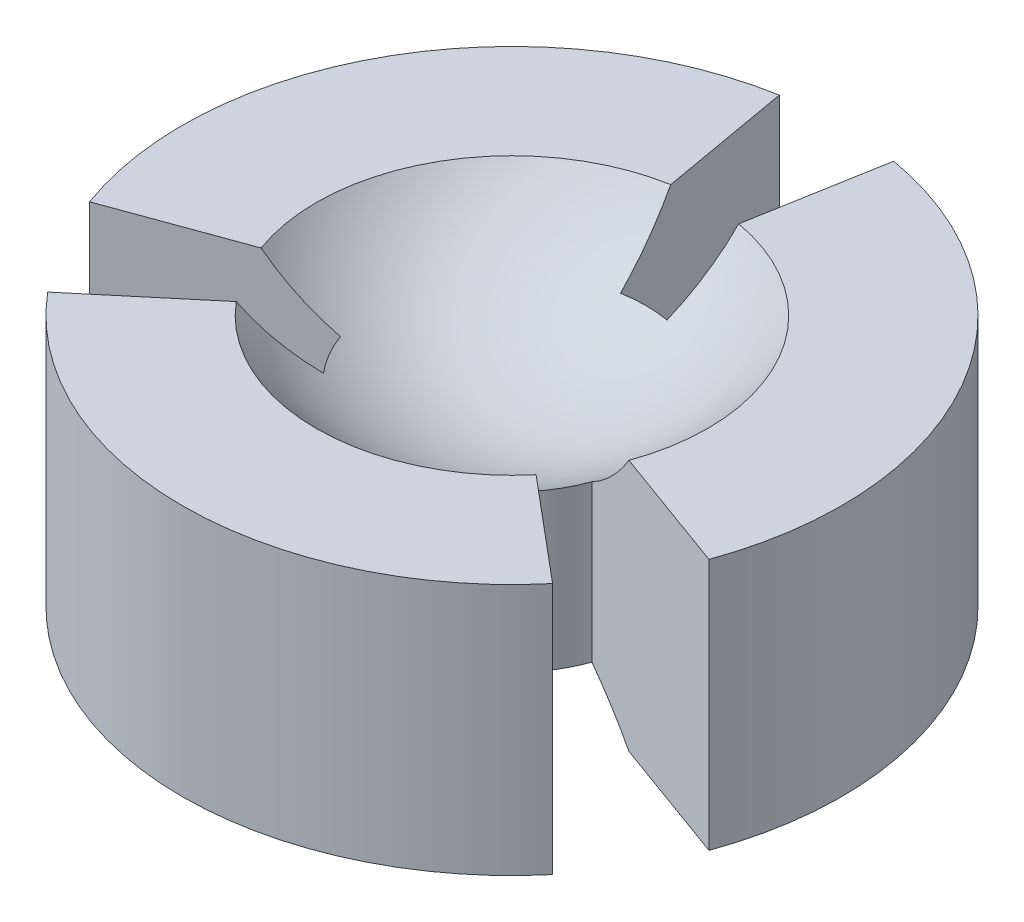
ISO-10303-21;
HEADER;
FILE_DESCRIPTION(('STEP AP214'),'2;1');
FILE_NAME('part.step','',(''),(''),'','','');
FILE_SCHEMA(('AUTOMOTIVE_DESIGN { 1 0 10303 214 1 1 1 1 }'));
ENDSEC;
DATA;
#1=APPLICATION_CONTEXT('core data for automotive mechanical design processes');
#2=APPLICATION_PROTOCOL_DEFINITION('international standard','automotive_design',2000,#1);
#3=PRODUCT_CONTEXT('',#1,'mechanical');
#4=PRODUCT('Part','Part','',(#3));
#5=PRODUCT_RELATED_PRODUCT_CATEGORY('part','',(#4));
#6=PRODUCT_DEFINITION_FORMATION('','',#4);
#7=PRODUCT_DEFINITION_CONTEXT('part definition',#1,'design');
#8=PRODUCT_DEFINITION('design','',#6,#7);
#9=PRODUCT_DEFINITION_SHAPE('','',#8);
#10=(LENGTH_UNIT() NAMED_UNIT(*) SI_UNIT(.MILLI.,.METRE.));
#11=(NAMED_UNIT(*) PLANE_ANGLE_UNIT() SI_UNIT($,.RADIAN.));
#12=(NAMED_UNIT(*) SI_UNIT($,.STERADIAN.) SOLID_ANGLE_UNIT());
#13=UNCERTAINTY_MEASURE_WITH_UNIT(LENGTH_MEASURE(1.E-05),#10,'distance_accuracy_value','');
#14=(GEOMETRIC_REPRESENTATION_CONTEXT(3) GLOBAL_UNCERTAINTY_ASSIGNED_CONTEXT((#13)) GLOBAL_UNIT_ASSIGNED_CONTEXT((#10,
#11,#12)) REPRESENTATION_CONTEXT('',''));
#15=CARTESIAN_POINT('',(0.,0.,0.));
#16=DIRECTION('',(0.,0.,1.));
#17=DIRECTION('',(1.,0.,0.));
#18=AXIS2_PLACEMENT_3D('',#15,#16,#17);
#19=CARTESIAN_POINT('',(0.,5.6,0.));
#20=DIRECTION('',(0.,1.,0.));
#21=DIRECTION('',(-1.,0.,0.));
#22=AXIS2_PLACEMENT_3D('',#19,#20,#21);
#23=PLANE('',#22);
#24=CARTESIAN_POINT('',(0.,5.6,0.));
#25=DIRECTION('',(0.,1.,0.));
#26=DIRECTION('',(-1.,0.,0.));
#27=AXIS2_PLACEMENT_3D('',#24,#25,#26);
#28=CIRCLE('',#27,4.92502957221124);
#29=CARTESIAN_POINT('',(-0.855222410170228,5.6,-4.85020730652802));
#30=VERTEX_POINT('',#29);
#31=CARTESIAN_POINT('',(-4.62801394615928,5.6,1.68445932017083));
#32=VERTEX_POINT('',#31);
#33=EDGE_CURVE('E351',#30,#32,#28,.T.);
#34=ORIENTED_EDGE('',*,*,#33,.F.);
#35=DIRECTION('',(0.173648177666931,0.,0.984807753012208));
#36=VECTOR('',#35,1.);
#37=CARTESIAN_POINT('',(-0.347296355333863,5.6,-1.96961550602442));
#38=LINE('',#37,#36);
#39=CARTESIAN_POINT('',(-0.507926054836366,5.6,-2.88059180050361));
#40=VERTEX_POINT('',#39);
#41=EDGE_CURVE('E375',#30,#40,#38,.T.);
#42=ORIENTED_EDGE('',*,*,#41,.T.);
#43=CARTESIAN_POINT('',(0.,5.6,0.));
#44=DIRECTION('',(0.,1.,0.));
#45=DIRECTION('',(-1.,0.,0.));
#46=AXIS2_PLACEMENT_3D('',#43,#44,#45);
#47=CIRCLE('',#46,2.92502957221124);
#48=CARTESIAN_POINT('',(-2.74862870458747,5.6,1.00041903351949));
#49=VERTEX_POINT('',#48);
#50=EDGE_CURVE('E216',#40,#49,#47,.T.);
#51=ORIENTED_EDGE('',*,*,#50,.T.);
#52=DIRECTION('',(-0.939692620785908,0.,0.342020143325671));
#53=VECTOR('',#52,1.);
#54=CARTESIAN_POINT('',(-1.87938524157182,5.6,0.68404028665132));
#55=LINE('',#54,#53);
#56=EDGE_CURVE('E307',#49,#32,#55,.T.);
#57=ORIENTED_EDGE('',*,*,#56,.T.);
#58=EDGE_LOOP('',(#34,#42,#51,#57));
#59=FACE_BOUND('',#58,.T.);
#60=ADVANCED_FACE('F47',(#59),#23,.F.);
#61=CARTESIAN_POINT('',(2.74862870458746,5.6,1.00041903351951));
#62=VERTEX_POINT('',#61);
#63=CARTESIAN_POINT('',(0.507926054836363,5.6,-2.88059180050361));
#64=VERTEX_POINT('',#63);
#65=EDGE_CURVE('E222',#62,#64,#47,.T.);
#66=ORIENTED_EDGE('',*,*,#65,.T.);
#67=DIRECTION('',(0.173648177666931,0.,-0.984807753012208));
#68=VECTOR('',#67,1.);
#69=CARTESIAN_POINT('',(0.34729635533386,5.6,-1.96961550602442));
#70=LINE('',#69,#68);
#71=CARTESIAN_POINT('',(0.855222410170223,5.6,-4.85020730652802));
#72=VERTEX_POINT('',#71);
#73=EDGE_CURVE('E372',#64,#72,#70,.T.);
#74=ORIENTED_EDGE('',*,*,#73,.T.);
#75=CARTESIAN_POINT('',(4.62801394615928,5.6,1.68445932017084));
#76=VERTEX_POINT('',#75);
#77=EDGE_CURVE('E353',#76,#72,#28,.T.);
#78=ORIENTED_EDGE('',*,*,#77,.F.);
#79=DIRECTION('',(-0.939692620785909,0.,-0.342020143325666));
#80=VECTOR('',#79,1.);
#81=CARTESIAN_POINT('',(1.87938524157181,5.6,0.684040286651345));
#82=LINE('',#81,#80);
#83=EDGE_CURVE('E280',#76,#62,#82,.T.);
#84=ORIENTED_EDGE('',*,*,#83,.T.);
#85=EDGE_LOOP('',(#66,#74,#78,#84));
#86=FACE_BOUND('',#85,.T.);
#87=ADVANCED_FACE('F370',(#86),#23,.F.);
#88=CARTESIAN_POINT('',(0.,9.36672218861416,0.));
#89=DIRECTION('',(0.,1.,0.));
#90=DIRECTION('',(-1.,0.,0.));
#91=AXIS2_PLACEMENT_3D('',#88,#89,#90);
#92=PLANE('',#91);
#93=DIRECTION('',(0.173648177666931,0.,0.984807753012208));
#94=VECTOR('',#93,1.);
#95=CARTESIAN_POINT('',(-0.347296355333863,9.36672218861416,-1.96961550602442));
#96=LINE('',#95,#94);
#97=CARTESIAN_POINT('',(-0.855222410170228,9.36672218861416,-4.85020730652802));
#98=VERTEX_POINT('',#97);
#99=CARTESIAN_POINT('',(-0.507926054836365,9.36672218861416,-2.8805918005036));
#100=VERTEX_POINT('',#99);
#101=EDGE_CURVE('E376',#98,#100,#96,.T.);
#102=ORIENTED_EDGE('',*,*,#101,.F.);
#103=CARTESIAN_POINT('',(0.,9.36672218861416,0.));
#104=DIRECTION('',(0.,1.,0.));
#105=DIRECTION('',(-1.,0.,0.));
#106=AXIS2_PLACEMENT_3D('',#103,#104,#105);
#107=CIRCLE('',#106,4.92502957221123);
#108=CARTESIAN_POINT('',(-4.62801394615928,9.36672218861416,1.68445932017083));
#109=VERTEX_POINT('',#108);
#110=EDGE_CURVE('E194',#98,#109,#107,.T.);
#111=ORIENTED_EDGE('',*,*,#110,.T.);
#112=DIRECTION('',(-0.939692620785908,0.,0.342020143325671));
#113=VECTOR('',#112,1.);
#114=CARTESIAN_POINT('',(-1.87938524157182,9.36672218861416,0.68404028665132));
#115=LINE('',#114,#113);
#116=CARTESIAN_POINT('',(-2.74862870458746,9.36672218861416,1.00041903351949));
#117=VERTEX_POINT('',#116);
#118=EDGE_CURVE('E176',#117,#109,#115,.T.);
#119=ORIENTED_EDGE('',*,*,#118,.F.);
#120=CARTESIAN_POINT('',(0.,9.36672218861415,0.));
#121=DIRECTION('',(0.,1.,0.));
#122=DIRECTION('',(-1.,0.,0.));
#123=AXIS2_PLACEMENT_3D('',#120,#121,#122);
#124=CIRCLE('',#123,2.92502957221123);
#125=EDGE_CURVE('E192',#100,#117,#124,.T.);
#126=ORIENTED_EDGE('',*,*,#125,.F.);
#127=EDGE_LOOP('',(#102,#111,#119,#126));
#128=FACE_BOUND('',#127,.T.);
#129=ADVANCED_FACE('F191',(#128),#92,.T.);
#130=DIRECTION('',(0.173648177666931,0.,-0.984807753012208));
#131=VECTOR('',#130,1.);
#132=CARTESIAN_POINT('',(0.34729635533386,9.36672218861416,-1.96961550602442));
#133=LINE('',#132,#131);
#134=CARTESIAN_POINT('',(0.507926054836362,9.36672218861416,-2.88059180050361));
#135=VERTEX_POINT('',#134);
#136=CARTESIAN_POINT('',(0.855222410170223,9.36672218861416,-4.85020730652802));
#137=VERTEX_POINT('',#136);
#138=EDGE_CURVE('E63',#135,#137,#133,.T.);
#139=ORIENTED_EDGE('',*,*,#138,.F.);
#140=CARTESIAN_POINT('',(2.74862870458746,9.36672218861416,1.00041903351951));
#141=VERTEX_POINT('',#140);
#142=EDGE_CURVE('E203',#141,#135,#124,.T.);
#143=ORIENTED_EDGE('',*,*,#142,.F.);
#144=DIRECTION('',(-0.939692620785909,0.,-0.342020143325666));
#145=VECTOR('',#144,1.);
#146=CARTESIAN_POINT('',(1.87938524157181,9.36672218861416,0.684040286651345));
#147=LINE('',#146,#145);
#148=CARTESIAN_POINT('',(4.62801394615928,9.36672218861416,1.68445932017084));
#149=VERTEX_POINT('',#148);
#150=EDGE_CURVE('E292',#149,#141,#147,.T.);
#151=ORIENTED_EDGE('',*,*,#150,.F.);
#152=EDGE_CURVE('E211',#149,#137,#107,.T.);
#153=ORIENTED_EDGE('',*,*,#152,.T.);
#154=EDGE_LOOP('',(#139,#143,#151,#153));
#155=FACE_BOUND('',#154,.T.);
#156=ADVANCED_FACE('F395',(#155),#92,.T.);
#157=CARTESIAN_POINT('',(0.,7.9,0.));
#158=DIRECTION('',(0.,1.,0.));
#159=DIRECTION('',(-1.,0.,0.));
#160=AXIS2_PLACEMENT_3D('',#157,#158,#159);
#161=CYLINDRICAL_SURFACE('',#160,4.92502957221124);
#162=ORIENTED_EDGE('',*,*,#110,.F.);
#163=DIRECTION('',(0.,1.,0.));
#164=VECTOR('',#163,1.);
#165=CARTESIAN_POINT('',(-0.855222410170228,7.9,-4.85020730652802));
#166=LINE('',#165,#164);
#167=EDGE_CURVE('E256',#98,#30,#166,.F.);
#168=ORIENTED_EDGE('',*,*,#167,.T.);
#169=ORIENTED_EDGE('',*,*,#33,.T.);
#170=DIRECTION('',(0.,1.,0.));
#171=VECTOR('',#170,1.);
#172=CARTESIAN_POINT('',(-4.62801394615928,7.9,1.68445932017083));
#173=LINE('',#172,#171);
#174=EDGE_CURVE('E233',#32,#109,#173,.T.);
#175=ORIENTED_EDGE('',*,*,#174,.T.);
#176=EDGE_LOOP('',(#162,#168,#169,#175));
#177=FACE_BOUND('',#176,.T.);
#178=ADVANCED_FACE('F405',(#177),#161,.T.);
#179=ORIENTED_EDGE('',*,*,#77,.T.);
#180=DIRECTION('',(0.,1.,0.));
#181=VECTOR('',#180,1.);
#182=CARTESIAN_POINT('',(0.855222410170223,7.9,-4.85020730652802));
#183=LINE('',#182,#181);
#184=EDGE_CURVE('E253',#72,#137,#183,.T.);
#185=ORIENTED_EDGE('',*,*,#184,.T.);
#186=ORIENTED_EDGE('',*,*,#152,.F.);
#187=DIRECTION('',(0.,1.,0.));
#188=VECTOR('',#187,1.);
#189=CARTESIAN_POINT('',(4.62801394615928,7.9,1.68445932017084));
#190=LINE('',#189,#188);
#191=EDGE_CURVE('E249',#149,#76,#190,.F.);
#192=ORIENTED_EDGE('',*,*,#191,.T.);
#193=EDGE_LOOP('',(#179,#185,#186,#192));
#194=FACE_BOUND('',#193,.T.);
#195=ADVANCED_FACE('F366',(#194),#161,.T.);
#196=CARTESIAN_POINT('',(-2.24070264975111,5.6,1.88017276698409));
#197=VERTEX_POINT('',#196);
#198=CARTESIAN_POINT('',(2.2407026497511,5.6,1.88017276698411));
#199=VERTEX_POINT('',#198);
#200=EDGE_CURVE('E223',#197,#199,#47,.T.);
#201=ORIENTED_EDGE('',*,*,#200,.T.);
#202=DIRECTION('',(0.766044443118979,0.,0.642787609686538));
#203=VECTOR('',#202,1.);
#204=CARTESIAN_POINT('',(1.53208888623795,5.6,1.28557521937309));
#205=LINE('',#204,#203);
#206=CARTESIAN_POINT('',(3.77279153598905,5.6,3.16574798635718));
#207=VERTEX_POINT('',#206);
#208=EDGE_CURVE('E285',#199,#207,#205,.T.);
#209=ORIENTED_EDGE('',*,*,#208,.T.);
#210=CARTESIAN_POINT('',(-3.77279153598906,5.6,3.16574798635718));
#211=VERTEX_POINT('',#210);
#212=EDGE_CURVE('E354',#211,#207,#28,.T.);
#213=ORIENTED_EDGE('',*,*,#212,.F.);
#214=DIRECTION('',(0.766044443118975,0.,-0.642787609686543));
#215=VECTOR('',#214,1.);
#216=CARTESIAN_POINT('',(-1.53208888623797,5.6,1.28557521937307));
#217=LINE('',#216,#215);
#218=EDGE_CURVE('E301',#211,#197,#217,.T.);
#219=ORIENTED_EDGE('',*,*,#218,.T.);
#220=EDGE_LOOP('',(#201,#209,#213,#219));
#221=FACE_BOUND('',#220,.T.);
#222=ADVANCED_FACE('F49',(#221),#23,.F.);
#223=CARTESIAN_POINT('',(0.,1.82210100084488,0.));
#224=DIRECTION('',(0.,1.,0.));
#225=DIRECTION('',(-1.,0.,0.));
#226=AXIS2_PLACEMENT_3D('',#223,#224,#225);
#227=SPHERICAL_SURFACE('',#226,4.77789899915513);
#228=CARTESIAN_POINT('',(0.,1.82210100084488,0.));
#229=DIRECTION('',(-0.984807753012208,0.,0.173648177666931));
#230=DIRECTION('',(0.173648177666931,0.,0.984807753012208));
#231=AXIS2_PLACEMENT_3D('',#228,#229,#230);
#232=CIRCLE('',#231,4.77789899915513);
#233=CARTESIAN_POINT('',(-0.347296355333864,6.16126207715071,-1.96961550602442));
#234=VERTEX_POINT('',#233);
#235=EDGE_CURVE('E339',#234,#40,#232,.T.);
#236=ORIENTED_EDGE('',*,*,#235,.F.);
#237=CARTESIAN_POINT('',(0.,6.16126207715071,0.));
#238=DIRECTION('',(0.,-1.,0.));
#239=DIRECTION('',(0.,0.,-1.));
#240=AXIS2_PLACEMENT_3D('',#237,#238,#239);
#241=CIRCLE('',#240,2.);
#242=CARTESIAN_POINT('',(0.34729635533386,6.16126207715071,-1.96961550602442));
#243=VERTEX_POINT('',#242);
#244=EDGE_CURVE('E348',#243,#234,#241,.F.);
#245=ORIENTED_EDGE('',*,*,#244,.F.);
#246=CARTESIAN_POINT('',(0.,1.82210100084488,0.));
#247=DIRECTION('',(0.984807753012208,0.,0.173648177666931));
#248=DIRECTION('',(0.173648177666931,0.,-0.984807753012208));
#249=AXIS2_PLACEMENT_3D('',#246,#247,#248);
#250=CIRCLE('',#249,4.77789899915513);
#251=EDGE_CURVE('E334',#64,#243,#250,.T.);
#252=ORIENTED_EDGE('',*,*,#251,.F.);
#253=ORIENTED_EDGE('',*,*,#65,.F.);
#254=CARTESIAN_POINT('',(0.,1.82210100084488,0.));
#255=DIRECTION('',(0.342020143325666,0.,-0.939692620785909));
#256=DIRECTION('',(-0.939692620785909,0.,-0.342020143325666));
#257=AXIS2_PLACEMENT_3D('',#254,#255,#256);
#258=CIRCLE('',#257,4.77789899915513);
#259=CARTESIAN_POINT('',(1.87938524157181,6.16126207715071,0.684040286651345));
#260=VERTEX_POINT('',#259);
#261=EDGE_CURVE('E327',#260,#62,#258,.T.);
#262=ORIENTED_EDGE('',*,*,#261,.F.);
#263=CARTESIAN_POINT('',(0.,6.16126207715071,0.));
#264=DIRECTION('',(0.,-1.,0.));
#265=DIRECTION('',(0.,0.,-1.));
#266=AXIS2_PLACEMENT_3D('',#263,#264,#265);
#267=CIRCLE('',#266,2.);
#268=CARTESIAN_POINT('',(1.53208888623795,6.16126207715071,1.28557521937309));
#269=VERTEX_POINT('',#268);
#270=EDGE_CURVE('E345',#269,#260,#267,.F.);
#271=ORIENTED_EDGE('',*,*,#270,.F.);
#272=CARTESIAN_POINT('',(0.,1.82210100084488,0.));
#273=DIRECTION('',(-0.642787609686538,0.,0.766044443118979));
#274=DIRECTION('',(0.766044443118979,0.,0.642787609686538));
#275=AXIS2_PLACEMENT_3D('',#272,#273,#274);
#276=CIRCLE('',#275,4.77789899915513);
#277=EDGE_CURVE('E278',#199,#269,#276,.T.);
#278=ORIENTED_EDGE('',*,*,#277,.F.);
#279=ORIENTED_EDGE('',*,*,#200,.F.);
#280=CARTESIAN_POINT('',(0.,1.82210100084488,0.));
#281=DIRECTION('',(0.642787609686542,0.,0.766044443118975));
#282=DIRECTION('',(0.766044443118976,0.,-0.642787609686543));
#283=AXIS2_PLACEMENT_3D('',#280,#281,#282);
#284=CIRCLE('',#283,4.77789899915513);
#285=CARTESIAN_POINT('',(-1.53208888623797,6.16126207715071,1.28557521937307));
#286=VERTEX_POINT('',#285);
#287=EDGE_CURVE('E318',#286,#197,#284,.T.);
#288=ORIENTED_EDGE('',*,*,#287,.F.);
#289=CARTESIAN_POINT('',(0.,6.16126207715071,0.));
#290=DIRECTION('',(0.,-1.,0.));
#291=DIRECTION('',(0.,0.,-1.));
#292=AXIS2_PLACEMENT_3D('',#289,#290,#291);
#293=CIRCLE('',#292,2.);
#294=CARTESIAN_POINT('',(-1.87938524157182,6.16126207715071,0.68404028665132));
#295=VERTEX_POINT('',#294);
#296=EDGE_CURVE('E342',#295,#286,#293,.F.);
#297=ORIENTED_EDGE('',*,*,#296,.F.);
#298=CARTESIAN_POINT('',(0.,1.82210100084488,0.));
#299=DIRECTION('',(-0.342020143325671,0.,-0.939692620785908));
#300=DIRECTION('',(-0.939692620785908,0.,0.342020143325671));
#301=AXIS2_PLACEMENT_3D('',#298,#299,#300);
#302=CIRCLE('',#301,4.77789899915513);
#303=EDGE_CURVE('E184',#49,#295,#302,.T.);
#304=ORIENTED_EDGE('',*,*,#303,.F.);
#305=ORIENTED_EDGE('',*,*,#50,.F.);
#306=EDGE_LOOP('',(#236,#245,#252,#253,#262,#271,#278,#279,#288,#297,#304,#305));
#307=FACE_BOUND('',#306,.T.);
#308=ADVANCED_FACE('F401',(#307),#227,.F.);
#309=CARTESIAN_POINT('',(0.,11.55,0.));
#310=DIRECTION('',(0.,1.,0.));
#311=DIRECTION('',(-1.,0.,0.));
#312=AXIS2_PLACEMENT_3D('',#309,#310,#311);
#313=SPHERICAL_SURFACE('',#312,3.65);
#314=CARTESIAN_POINT('',(0.,8.49672307184559,0.));
#315=DIRECTION('',(0.,1.,0.));
#316=DIRECTION('',(0.,0.,1.));
#317=AXIS2_PLACEMENT_3D('',#314,#315,#316);
#318=CIRCLE('',#317,2.);
#319=CARTESIAN_POINT('',(0.34729635533386,8.49672307184559,-1.96961550602442));
#320=VERTEX_POINT('',#319);
#321=CARTESIAN_POINT('',(-0.347296355333864,8.49672307184559,-1.96961550602442));
#322=VERTEX_POINT('',#321);
#323=EDGE_CURVE('E11',#320,#322,#318,.T.);
#324=ORIENTED_EDGE('',*,*,#323,.T.);
#325=CARTESIAN_POINT('',(0.,11.55,0.));
#326=DIRECTION('',(-0.984807753012208,0.,0.173648177666931));
#327=DIRECTION('',(0.173648177666931,0.,0.984807753012208));
#328=AXIS2_PLACEMENT_3D('',#325,#326,#327);
#329=CIRCLE('',#328,3.65);
#330=EDGE_CURVE('E201',#322,#100,#329,.F.);
#331=ORIENTED_EDGE('',*,*,#330,.T.);
#332=ORIENTED_EDGE('',*,*,#125,.T.);
#333=CARTESIAN_POINT('',(0.,11.55,0.));
#334=DIRECTION('',(-0.342020143325671,0.,-0.939692620785908));
#335=DIRECTION('',(-0.939692620785908,0.,0.342020143325671));
#336=AXIS2_PLACEMENT_3D('',#333,#334,#335);
#337=CIRCLE('',#336,3.65);
#338=CARTESIAN_POINT('',(-1.87938524157182,8.49672307184559,0.68404028665132));
#339=VERTEX_POINT('',#338);
#340=EDGE_CURVE('E173',#117,#339,#337,.F.);
#341=ORIENTED_EDGE('',*,*,#340,.T.);
#342=CARTESIAN_POINT('',(0.,8.49672307184559,0.));
#343=DIRECTION('',(0.,1.,0.));
#344=DIRECTION('',(0.,0.,1.));
#345=AXIS2_PLACEMENT_3D('',#342,#343,#344);
#346=CIRCLE('',#345,2.);
#347=CARTESIAN_POINT('',(-1.53208888623797,8.49672307184559,1.28557521937307));
#348=VERTEX_POINT('',#347);
#349=EDGE_CURVE('E260',#339,#348,#346,.T.);
#350=ORIENTED_EDGE('',*,*,#349,.T.);
#351=CARTESIAN_POINT('',(0.,11.55,0.));
#352=DIRECTION('',(0.642787609686542,0.,0.766044443118975));
#353=DIRECTION('',(0.766044443118976,0.,-0.642787609686543));
#354=AXIS2_PLACEMENT_3D('',#351,#352,#353);
#355=CIRCLE('',#354,3.65);
#356=CARTESIAN_POINT('',(-2.24070264975111,9.36672218861416,1.88017276698409));
#357=VERTEX_POINT('',#356);
#358=EDGE_CURVE('E315',#348,#357,#355,.F.);
#359=ORIENTED_EDGE('',*,*,#358,.T.);
#360=CARTESIAN_POINT('',(2.24070264975109,9.36672218861416,1.88017276698411));
#361=VERTEX_POINT('',#360);
#362=EDGE_CURVE('E206',#357,#361,#124,.T.);
#363=ORIENTED_EDGE('',*,*,#362,.T.);
#364=CARTESIAN_POINT('',(0.,11.55,0.));
#365=DIRECTION('',(-0.642787609686538,0.,0.766044443118979));
#366=DIRECTION('',(0.766044443118979,0.,0.642787609686538));
#367=AXIS2_PLACEMENT_3D('',#364,#365,#366);
#368=CIRCLE('',#367,3.65);
#369=CARTESIAN_POINT('',(1.53208888623795,8.49672307184559,1.28557521937309));
#370=VERTEX_POINT('',#369);
#371=EDGE_CURVE('E267',#361,#370,#368,.F.);
#372=ORIENTED_EDGE('',*,*,#371,.T.);
#373=CARTESIAN_POINT('',(0.,8.49672307184559,0.));
#374=DIRECTION('',(0.,1.,0.));
#375=DIRECTION('',(0.,0.,1.));
#376=AXIS2_PLACEMENT_3D('',#373,#374,#375);
#377=CIRCLE('',#376,2.);
#378=CARTESIAN_POINT('',(1.87938524157181,8.49672307184559,0.684040286651345));
#379=VERTEX_POINT('',#378);
#380=EDGE_CURVE('E56',#370,#379,#377,.T.);
#381=ORIENTED_EDGE('',*,*,#380,.T.);
#382=CARTESIAN_POINT('',(0.,11.55,0.));
#383=DIRECTION('',(0.342020143325666,0.,-0.939692620785909));
#384=DIRECTION('',(-0.939692620785909,0.,-0.342020143325666));
#385=AXIS2_PLACEMENT_3D('',#382,#383,#384);
#386=CIRCLE('',#385,3.65);
#387=EDGE_CURVE('E265',#379,#141,#386,.F.);
#388=ORIENTED_EDGE('',*,*,#387,.T.);
#389=ORIENTED_EDGE('',*,*,#142,.T.);
#390=CARTESIAN_POINT('',(0.,11.55,0.));
#391=DIRECTION('',(0.984807753012208,0.,0.173648177666931));
#392=DIRECTION('',(0.173648177666931,0.,-0.984807753012208));
#393=AXIS2_PLACEMENT_3D('',#390,#391,#392);
#394=CIRCLE('',#393,3.65);
#395=EDGE_CURVE('E330',#135,#320,#394,.F.);
#396=ORIENTED_EDGE('',*,*,#395,.T.);
#397=EDGE_LOOP('',(#324,#331,#332,#341,#350,#359,#363,#372,#381,#388,#389,#396));
#398=FACE_BOUND('',#397,.T.);
#399=ADVANCED_FACE('F200',(#398),#313,.F.);
#400=DIRECTION('',(0.766044443118979,0.,0.642787609686538));
#401=VECTOR('',#400,1.);
#402=CARTESIAN_POINT('',(1.53208888623795,9.36672218861416,1.28557521937309));
#403=LINE('',#402,#401);
#404=CARTESIAN_POINT('',(3.77279153598905,9.36672218861416,3.16574798635718));
#405=VERTEX_POINT('',#404);
#406=EDGE_CURVE('E71',#361,#405,#403,.T.);
#407=ORIENTED_EDGE('',*,*,#406,.F.);
#408=ORIENTED_EDGE('',*,*,#362,.F.);
#409=DIRECTION('',(0.766044443118975,0.,-0.642787609686543));
#410=VECTOR('',#409,1.);
#411=CARTESIAN_POINT('',(-1.53208888623797,9.36672218861416,1.28557521937307));
#412=LINE('',#411,#410);
#413=CARTESIAN_POINT('',(-3.77279153598906,9.36672218861416,3.16574798635718));
#414=VERTEX_POINT('',#413);
#415=EDGE_CURVE('E197',#414,#357,#412,.T.);
#416=ORIENTED_EDGE('',*,*,#415,.F.);
#417=EDGE_CURVE('E204',#414,#405,#107,.T.);
#418=ORIENTED_EDGE('',*,*,#417,.T.);
#419=EDGE_LOOP('',(#407,#408,#416,#418));
#420=FACE_BOUND('',#419,.T.);
#421=ADVANCED_FACE('F417',(#420),#92,.T.);
#422=ORIENTED_EDGE('',*,*,#212,.T.);
#423=DIRECTION('',(0.,1.,0.));
#424=VECTOR('',#423,1.);
#425=CARTESIAN_POINT('',(3.77279153598905,7.9,3.16574798635718));
#426=LINE('',#425,#424);
#427=EDGE_CURVE('E244',#207,#405,#426,.T.);
#428=ORIENTED_EDGE('',*,*,#427,.T.);
#429=ORIENTED_EDGE('',*,*,#417,.F.);
#430=DIRECTION('',(0.,1.,0.));
#431=VECTOR('',#430,1.);
#432=CARTESIAN_POINT('',(-3.77279153598906,7.9,3.16574798635718));
#433=LINE('',#432,#431);
#434=EDGE_CURVE('E239',#414,#211,#433,.F.);
#435=ORIENTED_EDGE('',*,*,#434,.T.);
#436=EDGE_LOOP('',(#422,#428,#429,#435));
#437=FACE_BOUND('',#436,.T.);
#438=ADVANCED_FACE('F419',(#437),#161,.T.);
#439=CARTESIAN_POINT('',(0.,5.6,0.));
#440=DIRECTION('',(0.,1.,0.));
#441=DIRECTION('',(0.,0.,1.));
#442=AXIS2_PLACEMENT_3D('',#439,#440,#441);
#443=CYLINDRICAL_SURFACE('',#442,2.);
#444=ORIENTED_EDGE('',*,*,#296,.T.);
#445=DIRECTION('',(0.,1.,0.));
#446=VECTOR('',#445,1.);
#447=CARTESIAN_POINT('',(-1.53208888623797,5.6,1.28557521937307));
#448=LINE('',#447,#446);
#449=EDGE_CURVE('E302',#286,#348,#448,.T.);
#450=ORIENTED_EDGE('',*,*,#449,.T.);
#451=ORIENTED_EDGE('',*,*,#349,.F.);
#452=DIRECTION('',(0.,1.,0.));
#453=VECTOR('',#452,1.);
#454=CARTESIAN_POINT('',(-1.87938524157182,5.6,0.68404028665132));
#455=LINE('',#454,#453);
#456=EDGE_CURVE('E179',#295,#339,#455,.T.);
#457=ORIENTED_EDGE('',*,*,#456,.F.);
#458=EDGE_LOOP('',(#444,#450,#451,#457));
#459=FACE_BOUND('',#458,.T.);
#460=ADVANCED_FACE('F412',(#459),#443,.T.);
#461=CARTESIAN_POINT('',(-1.53208888623797,5.6,1.28557521937307));
#462=DIRECTION('',(0.642787609686542,0.,0.766044443118975));
#463=DIRECTION('',(0.766044443118976,0.,-0.642787609686543));
#464=AXIS2_PLACEMENT_3D('',#461,#462,#463);
#465=PLANE('',#464);
#466=ORIENTED_EDGE('',*,*,#287,.T.);
#467=ORIENTED_EDGE('',*,*,#218,.F.);
#468=ORIENTED_EDGE('',*,*,#434,.F.);
#469=ORIENTED_EDGE('',*,*,#415,.T.);
#470=ORIENTED_EDGE('',*,*,#358,.F.);
#471=ORIENTED_EDGE('',*,*,#449,.F.);
#472=EDGE_LOOP('',(#466,#467,#468,#469,#470,#471));
#473=FACE_BOUND('',#472,.T.);
#474=ADVANCED_FACE('F414',(#473),#465,.F.);
#475=CARTESIAN_POINT('',(-1.87938524157182,5.6,0.68404028665132));
#476=DIRECTION('',(-0.342020143325671,0.,-0.939692620785908));
#477=DIRECTION('',(-0.939692620785908,0.,0.342020143325671));
#478=AXIS2_PLACEMENT_3D('',#475,#476,#477);
#479=PLANE('',#478);
#480=ORIENTED_EDGE('',*,*,#303,.T.);
#481=ORIENTED_EDGE('',*,*,#456,.T.);
#482=ORIENTED_EDGE('',*,*,#340,.F.);
#483=ORIENTED_EDGE('',*,*,#118,.T.);
#484=ORIENTED_EDGE('',*,*,#174,.F.);
#485=ORIENTED_EDGE('',*,*,#56,.F.);
#486=EDGE_LOOP('',(#480,#481,#482,#483,#484,#485));
#487=FACE_BOUND('',#486,.T.);
#488=ADVANCED_FACE('F175',(#487),#479,.F.);
#489=CARTESIAN_POINT('',(0.,5.6,0.));
#490=DIRECTION('',(0.,1.,0.));
#491=DIRECTION('',(0.,0.,1.));
#492=AXIS2_PLACEMENT_3D('',#489,#490,#491);
#493=CYLINDRICAL_SURFACE('',#492,2.);
#494=ORIENTED_EDGE('',*,*,#270,.T.);
#495=DIRECTION('',(0.,1.,0.));
#496=VECTOR('',#495,1.);
#497=CARTESIAN_POINT('',(1.87938524157181,5.6,0.684040286651345));
#498=LINE('',#497,#496);
#499=EDGE_CURVE('E196',#260,#379,#498,.T.);
#500=ORIENTED_EDGE('',*,*,#499,.T.);
#501=ORIENTED_EDGE('',*,*,#380,.F.);
#502=DIRECTION('',(0.,1.,0.));
#503=VECTOR('',#502,1.);
#504=CARTESIAN_POINT('',(1.53208888623795,5.6,1.28557521937309));
#505=LINE('',#504,#503);
#506=EDGE_CURVE('E273',#269,#370,#505,.T.);
#507=ORIENTED_EDGE('',*,*,#506,.F.);
#508=EDGE_LOOP('',(#494,#500,#501,#507));
#509=FACE_BOUND('',#508,.T.);
#510=ADVANCED_FACE('F272',(#509),#493,.T.);
#511=CARTESIAN_POINT('',(1.87938524157181,5.6,0.684040286651345));
#512=DIRECTION('',(0.342020143325666,0.,-0.939692620785909));
#513=DIRECTION('',(-0.939692620785909,0.,-0.342020143325666));
#514=AXIS2_PLACEMENT_3D('',#511,#512,#513);
#515=PLANE('',#514);
#516=ORIENTED_EDGE('',*,*,#261,.T.);
#517=ORIENTED_EDGE('',*,*,#83,.F.);
#518=ORIENTED_EDGE('',*,*,#191,.F.);
#519=ORIENTED_EDGE('',*,*,#150,.T.);
#520=ORIENTED_EDGE('',*,*,#387,.F.);
#521=ORIENTED_EDGE('',*,*,#499,.F.);
#522=EDGE_LOOP('',(#516,#517,#518,#519,#520,#521));
#523=FACE_BOUND('',#522,.T.);
#524=ADVANCED_FACE('F397',(#523),#515,.F.);
#525=CARTESIAN_POINT('',(1.53208888623795,5.6,1.28557521937309));
#526=DIRECTION('',(-0.642787609686538,0.,0.766044443118979));
#527=DIRECTION('',(0.766044443118979,0.,0.642787609686538));
#528=AXIS2_PLACEMENT_3D('',#525,#526,#527);
#529=PLANE('',#528);
#530=ORIENTED_EDGE('',*,*,#277,.T.);
#531=ORIENTED_EDGE('',*,*,#506,.T.);
#532=ORIENTED_EDGE('',*,*,#371,.F.);
#533=ORIENTED_EDGE('',*,*,#406,.T.);
#534=ORIENTED_EDGE('',*,*,#427,.F.);
#535=ORIENTED_EDGE('',*,*,#208,.F.);
#536=EDGE_LOOP('',(#530,#531,#532,#533,#534,#535));
#537=FACE_BOUND('',#536,.T.);
#538=ADVANCED_FACE('F276',(#537),#529,.F.);
#539=CARTESIAN_POINT('',(0.,5.6,0.));
#540=DIRECTION('',(0.,1.,0.));
#541=DIRECTION('',(0.,0.,1.));
#542=AXIS2_PLACEMENT_3D('',#539,#540,#541);
#543=CYLINDRICAL_SURFACE('',#542,2.);
#544=ORIENTED_EDGE('',*,*,#244,.T.);
#545=DIRECTION('',(0.,1.,0.));
#546=VECTOR('',#545,1.);
#547=CARTESIAN_POINT('',(-0.347296355333863,5.6,-1.96961550602442));
#548=LINE('',#547,#546);
#549=EDGE_CURVE('E185',#234,#322,#548,.T.);
#550=ORIENTED_EDGE('',*,*,#549,.T.);
#551=ORIENTED_EDGE('',*,*,#323,.F.);
#552=DIRECTION('',(0.,1.,0.));
#553=VECTOR('',#552,1.);
#554=CARTESIAN_POINT('',(0.34729635533386,5.6,-1.96961550602442));
#555=LINE('',#554,#553);
#556=EDGE_CURVE('E289',#243,#320,#555,.T.);
#557=ORIENTED_EDGE('',*,*,#556,.F.);
#558=EDGE_LOOP('',(#544,#550,#551,#557));
#559=FACE_BOUND('',#558,.T.);
#560=ADVANCED_FACE('F402',(#559),#543,.T.);
#561=CARTESIAN_POINT('',(-0.347296355333863,5.6,-1.96961550602442));
#562=DIRECTION('',(-0.984807753012208,0.,0.173648177666931));
#563=DIRECTION('',(0.173648177666931,0.,0.984807753012208));
#564=AXIS2_PLACEMENT_3D('',#561,#562,#563);
#565=PLANE('',#564);
#566=ORIENTED_EDGE('',*,*,#235,.T.);
#567=ORIENTED_EDGE('',*,*,#41,.F.);
#568=ORIENTED_EDGE('',*,*,#167,.F.);
#569=ORIENTED_EDGE('',*,*,#101,.T.);
#570=ORIENTED_EDGE('',*,*,#330,.F.);
#571=ORIENTED_EDGE('',*,*,#549,.F.);
#572=EDGE_LOOP('',(#566,#567,#568,#569,#570,#571));
#573=FACE_BOUND('',#572,.T.);
#574=ADVANCED_FACE('F404',(#573),#565,.F.);
#575=CARTESIAN_POINT('',(0.34729635533386,5.6,-1.96961550602442));
#576=DIRECTION('',(0.984807753012208,0.,0.173648177666931));
#577=DIRECTION('',(0.173648177666931,0.,-0.984807753012208));
#578=AXIS2_PLACEMENT_3D('',#575,#576,#577);
#579=PLANE('',#578);
#580=ORIENTED_EDGE('',*,*,#251,.T.);
#581=ORIENTED_EDGE('',*,*,#556,.T.);
#582=ORIENTED_EDGE('',*,*,#395,.F.);
#583=ORIENTED_EDGE('',*,*,#138,.T.);
#584=ORIENTED_EDGE('',*,*,#184,.F.);
#585=ORIENTED_EDGE('',*,*,#73,.F.);
#586=EDGE_LOOP('',(#580,#581,#582,#583,#584,#585));
#587=FACE_BOUND('',#586,.T.);
#588=ADVANCED_FACE('F391',(#587),#579,.F.);
#589=CLOSED_SHELL('',(#60,#87,#129,#156,#178,#195,#222,#308,#399,#421,#438,#460,#474,#488,#510,
#524,#538,#560,#574,#588));
#590=MANIFOLD_SOLID_BREP('B2',#589);
#591=ADVANCED_BREP_SHAPE_REPRESENTATION('',(#18,#590),#14);
#592=SHAPE_DEFINITION_REPRESENTATION(#9,#591);
ENDSEC;
END-ISO-10303-21;
